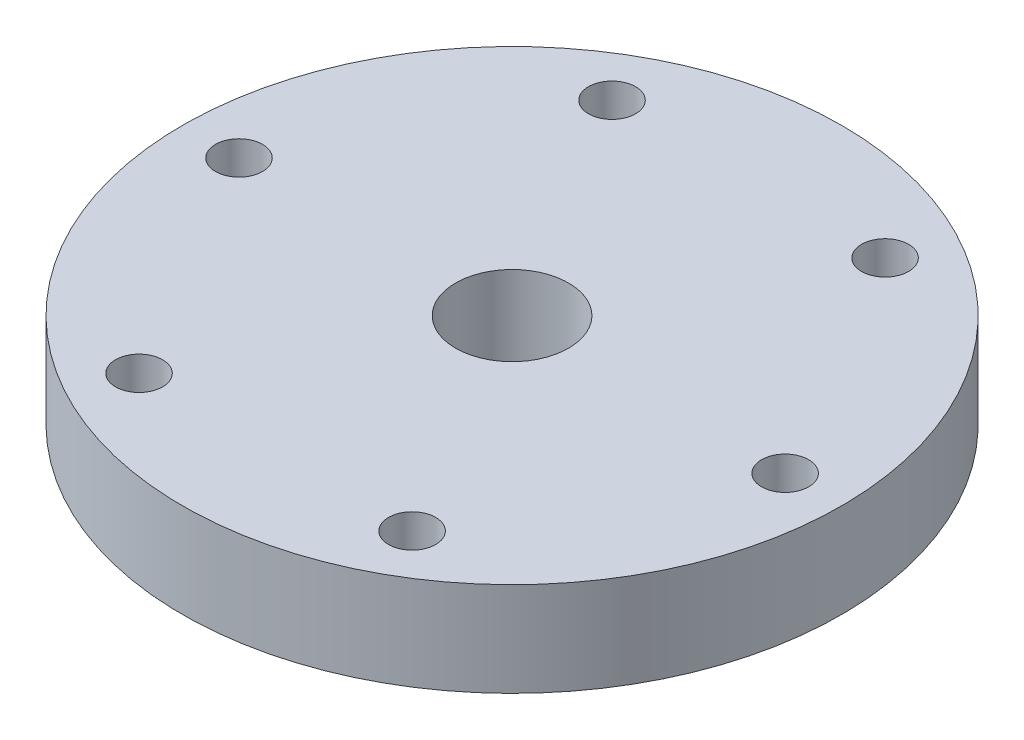
ISO-10303-21;
HEADER;
FILE_DESCRIPTION(('STEP AP214'),'2;1');
FILE_NAME('part.step','',(''),(''),'','','');
FILE_SCHEMA(('AUTOMOTIVE_DESIGN { 1 0 10303 214 1 1 1 1 }'));
ENDSEC;
DATA;
#1=APPLICATION_CONTEXT('core data for automotive mechanical design processes');
#2=APPLICATION_PROTOCOL_DEFINITION('international standard','automotive_design',2000,#1);
#3=PRODUCT_CONTEXT('',#1,'mechanical');
#4=PRODUCT('Part','Part','',(#3));
#5=PRODUCT_RELATED_PRODUCT_CATEGORY('part','',(#4));
#6=PRODUCT_DEFINITION_FORMATION('','',#4);
#7=PRODUCT_DEFINITION_CONTEXT('part definition',#1,'design');
#8=PRODUCT_DEFINITION('design','',#6,#7);
#9=PRODUCT_DEFINITION_SHAPE('','',#8);
#10=(LENGTH_UNIT() NAMED_UNIT(*) SI_UNIT(.MILLI.,.METRE.));
#11=(NAMED_UNIT(*) PLANE_ANGLE_UNIT() SI_UNIT($,.RADIAN.));
#12=(NAMED_UNIT(*) SI_UNIT($,.STERADIAN.) SOLID_ANGLE_UNIT());
#13=UNCERTAINTY_MEASURE_WITH_UNIT(LENGTH_MEASURE(1.E-05),#10,'distance_accuracy_value','');
#14=(GEOMETRIC_REPRESENTATION_CONTEXT(3) GLOBAL_UNCERTAINTY_ASSIGNED_CONTEXT((#13)) GLOBAL_UNIT_ASSIGNED_CONTEXT((#10,
#11,#12)) REPRESENTATION_CONTEXT('',''));
#15=CARTESIAN_POINT('',(0.,0.,0.));
#16=DIRECTION('',(0.,0.,1.));
#17=DIRECTION('',(1.,0.,0.));
#18=AXIS2_PLACEMENT_3D('',#15,#16,#17);
#19=CARTESIAN_POINT('',(15.,0.,0.));
#20=DIRECTION('',(0.,-1.,0.));
#21=DIRECTION('',(0.,0.,-1.));
#22=AXIS2_PLACEMENT_3D('',#19,#20,#21);
#23=PLANE('',#22);
#24=CARTESIAN_POINT('',(0.,0.,0.));
#25=DIRECTION('',(0.,1.,0.));
#26=DIRECTION('',(0.,0.,1.));
#27=AXIS2_PLACEMENT_3D('',#24,#25,#26);
#28=CIRCLE('',#27,5.99999999999999);
#29=CARTESIAN_POINT('',(0.,0.,5.99999999999999));
#30=VERTEX_POINT('',#29);
#31=EDGE_CURVE('E112',#30,#30,#28,.T.);
#32=ORIENTED_EDGE('',*,*,#31,.T.);
#33=EDGE_LOOP('',(#32));
#34=FACE_BOUND('',#33,.T.);
#35=CARTESIAN_POINT('',(0.,0.,0.));
#36=DIRECTION('',(0.,-1.,0.));
#37=DIRECTION('',(0.,0.,-1.));
#38=AXIS2_PLACEMENT_3D('',#35,#36,#37);
#39=CIRCLE('',#38,15.);
#40=CARTESIAN_POINT('',(0.,0.,-15.));
#41=VERTEX_POINT('',#40);
#42=EDGE_CURVE('E124',#41,#41,#39,.T.);
#43=ORIENTED_EDGE('',*,*,#42,.T.);
#44=EDGE_LOOP('',(#43));
#45=FACE_BOUND('',#44,.T.);
#46=ADVANCED_FACE('F47',(#34,#45),#23,.T.);
#47=CARTESIAN_POINT('',(2.,15.,0.));
#48=DIRECTION('',(0.,1.,0.));
#49=DIRECTION('',(0.,0.,1.));
#50=AXIS2_PLACEMENT_3D('',#47,#48,#49);
#51=PLANE('',#50);
#52=CARTESIAN_POINT('',(14.5000000000003,15.,-25.1147367097486));
#53=DIRECTION('',(0.,1.,0.));
#54=DIRECTION('',(0.,0.,1.));
#55=AXIS2_PLACEMENT_3D('',#52,#53,#54);
#56=CIRCLE('',#55,2.49999999999999);
#57=CARTESIAN_POINT('',(14.5000000000003,15.,-22.6147367097486));
#58=VERTEX_POINT('',#57);
#59=EDGE_CURVE('E100',#58,#58,#56,.T.);
#60=ORIENTED_EDGE('',*,*,#59,.F.);
#61=EDGE_LOOP('',(#60));
#62=FACE_BOUND('',#61,.T.);
#63=CARTESIAN_POINT('',(-14.4999999999998,15.,-25.1147367097489));
#64=DIRECTION('',(0.,1.,0.));
#65=DIRECTION('',(0.,0.,1.));
#66=AXIS2_PLACEMENT_3D('',#63,#64,#65);
#67=CIRCLE('',#66,2.49999999999999);
#68=CARTESIAN_POINT('',(-14.4999999999998,15.,-22.6147367097489));
#69=VERTEX_POINT('',#68);
#70=EDGE_CURVE('E85',#69,#69,#67,.T.);
#71=ORIENTED_EDGE('',*,*,#70,.F.);
#72=EDGE_LOOP('',(#71));
#73=FACE_BOUND('',#72,.T.);
#74=CARTESIAN_POINT('',(-29.,15.,0.));
#75=DIRECTION('',(0.,1.,0.));
#76=DIRECTION('',(0.,0.,1.));
#77=AXIS2_PLACEMENT_3D('',#74,#75,#76);
#78=CIRCLE('',#77,2.49999999999999);
#79=CARTESIAN_POINT('',(-29.,15.,2.49999999999999));
#80=VERTEX_POINT('',#79);
#81=EDGE_CURVE('E81',#80,#80,#78,.T.);
#82=ORIENTED_EDGE('',*,*,#81,.F.);
#83=EDGE_LOOP('',(#82));
#84=FACE_BOUND('',#83,.T.);
#85=CARTESIAN_POINT('',(-14.5000000000001,15.,25.1147367097487));
#86=DIRECTION('',(0.,1.,0.));
#87=DIRECTION('',(0.,0.,1.));
#88=AXIS2_PLACEMENT_3D('',#85,#86,#87);
#89=CIRCLE('',#88,2.49999999999999);
#90=CARTESIAN_POINT('',(-14.5000000000001,15.,27.6147367097486));
#91=VERTEX_POINT('',#90);
#92=EDGE_CURVE('E77',#91,#91,#89,.T.);
#93=ORIENTED_EDGE('',*,*,#92,.F.);
#94=EDGE_LOOP('',(#93));
#95=FACE_BOUND('',#94,.T.);
#96=CARTESIAN_POINT('',(14.4999999999999,15.,25.1147367097488));
#97=DIRECTION('',(0.,1.,0.));
#98=DIRECTION('',(0.,0.,1.));
#99=AXIS2_PLACEMENT_3D('',#96,#97,#98);
#100=CIRCLE('',#99,2.49999999999999);
#101=CARTESIAN_POINT('',(14.4999999999999,15.,27.6147367097487));
#102=VERTEX_POINT('',#101);
#103=EDGE_CURVE('E72',#102,#102,#100,.T.);
#104=ORIENTED_EDGE('',*,*,#103,.F.);
#105=EDGE_LOOP('',(#104));
#106=FACE_BOUND('',#105,.T.);
#107=CARTESIAN_POINT('',(0.,15.,0.));
#108=DIRECTION('',(0.,1.,0.));
#109=DIRECTION('',(0.,0.,1.));
#110=AXIS2_PLACEMENT_3D('',#107,#108,#109);
#111=CIRCLE('',#110,5.99999999999999);
#112=CARTESIAN_POINT('',(0.,15.,5.99999999999999));
#113=VERTEX_POINT('',#112);
#114=EDGE_CURVE('E71',#113,#113,#111,.T.);
#115=ORIENTED_EDGE('',*,*,#114,.F.);
#116=EDGE_LOOP('',(#115));
#117=FACE_BOUND('',#116,.T.);
#118=CARTESIAN_POINT('',(29.,15.,0.));
#119=DIRECTION('',(0.,1.,0.));
#120=DIRECTION('',(0.,0.,1.));
#121=AXIS2_PLACEMENT_3D('',#118,#119,#120);
#122=CIRCLE('',#121,2.49999999999998);
#123=CARTESIAN_POINT('',(29.,15.,2.49999999999998));
#124=VERTEX_POINT('',#123);
#125=EDGE_CURVE('E116',#124,#124,#122,.T.);
#126=ORIENTED_EDGE('',*,*,#125,.F.);
#127=EDGE_LOOP('',(#126));
#128=FACE_BOUND('',#127,.T.);
#129=CARTESIAN_POINT('',(0.,15.,0.));
#130=DIRECTION('',(0.,-1.,0.));
#131=DIRECTION('',(0.,0.,-1.));
#132=AXIS2_PLACEMENT_3D('',#129,#130,#131);
#133=CIRCLE('',#132,35.);
#134=CARTESIAN_POINT('',(0.,15.,-35.));
#135=VERTEX_POINT('',#134);
#136=EDGE_CURVE('E63',#135,#135,#133,.T.);
#137=ORIENTED_EDGE('',*,*,#136,.F.);
#138=EDGE_LOOP('',(#137));
#139=FACE_BOUND('',#138,.T.);
#140=ADVANCED_FACE('F139',(#62,#73,#84,#95,#106,#117,#128,#139),#51,.T.);
#141=CARTESIAN_POINT('',(0.,0.,0.));
#142=DIRECTION('',(0.,-1.,0.));
#143=DIRECTION('',(0.,0.,-1.));
#144=AXIS2_PLACEMENT_3D('',#141,#142,#143);
#145=CYLINDRICAL_SURFACE('',#144,35.);
#146=ORIENTED_EDGE('',*,*,#136,.T.);
#147=EDGE_LOOP('',(#146));
#148=FACE_BOUND('',#147,.T.);
#149=CARTESIAN_POINT('',(0.,5.,0.));
#150=DIRECTION('',(0.,-1.,0.));
#151=DIRECTION('',(0.,0.,-1.));
#152=AXIS2_PLACEMENT_3D('',#149,#150,#151);
#153=CIRCLE('',#152,35.);
#154=CARTESIAN_POINT('',(0.,5.,-35.));
#155=VERTEX_POINT('',#154);
#156=EDGE_CURVE('E128',#155,#155,#153,.T.);
#157=ORIENTED_EDGE('',*,*,#156,.F.);
#158=EDGE_LOOP('',(#157));
#159=FACE_BOUND('',#158,.T.);
#160=ADVANCED_FACE('F136',(#148,#159),#145,.T.);
#161=CARTESIAN_POINT('',(35.,5.,0.));
#162=DIRECTION('',(0.,-1.,0.));
#163=DIRECTION('',(0.,0.,-1.));
#164=AXIS2_PLACEMENT_3D('',#161,#162,#163);
#165=PLANE('',#164);
#166=CARTESIAN_POINT('',(14.5000000000003,5.,-25.1147367097486));
#167=DIRECTION('',(0.,-1.,0.));
#168=DIRECTION('',(0.,0.,-1.));
#169=AXIS2_PLACEMENT_3D('',#166,#167,#168);
#170=CIRCLE('',#169,2.49999999999999);
#171=CARTESIAN_POINT('',(14.5000000000003,5.,-27.6147367097485));
#172=VERTEX_POINT('',#171);
#173=EDGE_CURVE('E51',#172,#172,#170,.T.);
#174=ORIENTED_EDGE('',*,*,#173,.F.);
#175=EDGE_LOOP('',(#174));
#176=FACE_BOUND('',#175,.T.);
#177=CARTESIAN_POINT('',(-14.4999999999998,5.,-25.1147367097489));
#178=DIRECTION('',(0.,-1.,0.));
#179=DIRECTION('',(0.,0.,-1.));
#180=AXIS2_PLACEMENT_3D('',#177,#178,#179);
#181=CIRCLE('',#180,2.49999999999999);
#182=CARTESIAN_POINT('',(-14.4999999999998,5.,-27.6147367097488));
#183=VERTEX_POINT('',#182);
#184=EDGE_CURVE('E82',#183,#183,#181,.T.);
#185=ORIENTED_EDGE('',*,*,#184,.F.);
#186=EDGE_LOOP('',(#185));
#187=FACE_BOUND('',#186,.T.);
#188=CARTESIAN_POINT('',(-29.,5.,0.));
#189=DIRECTION('',(0.,-1.,0.));
#190=DIRECTION('',(0.,0.,-1.));
#191=AXIS2_PLACEMENT_3D('',#188,#189,#190);
#192=CIRCLE('',#191,2.49999999999999);
#193=CARTESIAN_POINT('',(-29.,5.,-2.49999999999999));
#194=VERTEX_POINT('',#193);
#195=EDGE_CURVE('E78',#194,#194,#192,.T.);
#196=ORIENTED_EDGE('',*,*,#195,.F.);
#197=EDGE_LOOP('',(#196));
#198=FACE_BOUND('',#197,.T.);
#199=CARTESIAN_POINT('',(-14.5000000000001,5.,25.1147367097487));
#200=DIRECTION('',(0.,-1.,0.));
#201=DIRECTION('',(0.,0.,-1.));
#202=AXIS2_PLACEMENT_3D('',#199,#200,#201);
#203=CIRCLE('',#202,2.49999999999999);
#204=CARTESIAN_POINT('',(-14.5000000000001,5.,22.6147367097487));
#205=VERTEX_POINT('',#204);
#206=EDGE_CURVE('E73',#205,#205,#203,.T.);
#207=ORIENTED_EDGE('',*,*,#206,.F.);
#208=EDGE_LOOP('',(#207));
#209=FACE_BOUND('',#208,.T.);
#210=CARTESIAN_POINT('',(14.4999999999999,5.,25.1147367097488));
#211=DIRECTION('',(0.,-1.,0.));
#212=DIRECTION('',(0.,0.,-1.));
#213=AXIS2_PLACEMENT_3D('',#210,#211,#212);
#214=CIRCLE('',#213,2.49999999999999);
#215=CARTESIAN_POINT('',(14.4999999999999,5.,22.6147367097488));
#216=VERTEX_POINT('',#215);
#217=EDGE_CURVE('E67',#216,#216,#214,.T.);
#218=ORIENTED_EDGE('',*,*,#217,.F.);
#219=EDGE_LOOP('',(#218));
#220=FACE_BOUND('',#219,.T.);
#221=CARTESIAN_POINT('',(29.,5.,0.));
#222=DIRECTION('',(0.,-1.,0.));
#223=DIRECTION('',(0.,0.,-1.));
#224=AXIS2_PLACEMENT_3D('',#221,#222,#223);
#225=CIRCLE('',#224,2.49999999999999);
#226=CARTESIAN_POINT('',(29.,5.,-2.49999999999999));
#227=VERTEX_POINT('',#226);
#228=EDGE_CURVE('E120',#227,#227,#225,.T.);
#229=ORIENTED_EDGE('',*,*,#228,.F.);
#230=EDGE_LOOP('',(#229));
#231=FACE_BOUND('',#230,.T.);
#232=CARTESIAN_POINT('',(0.,5.,0.));
#233=DIRECTION('',(0.,-1.,0.));
#234=DIRECTION('',(0.,0.,-1.));
#235=AXIS2_PLACEMENT_3D('',#232,#233,#234);
#236=CIRCLE('',#235,17.);
#237=CARTESIAN_POINT('',(0.,5.,-17.));
#238=VERTEX_POINT('',#237);
#239=EDGE_CURVE('E10',#238,#238,#236,.F.);
#240=ORIENTED_EDGE('',*,*,#239,.T.);
#241=EDGE_LOOP('',(#240));
#242=FACE_BOUND('',#241,.T.);
#243=ORIENTED_EDGE('',*,*,#156,.T.);
#244=EDGE_LOOP('',(#243));
#245=FACE_BOUND('',#244,.T.);
#246=ADVANCED_FACE('F147',(#176,#187,#198,#209,#220,#231,#242,#245),#165,.T.);
#247=CARTESIAN_POINT('',(0.,0.,0.));
#248=DIRECTION('',(0.,-1.,0.));
#249=DIRECTION('',(0.,0.,-1.));
#250=AXIS2_PLACEMENT_3D('',#247,#248,#249);
#251=CYLINDRICAL_SURFACE('',#250,15.);
#252=CARTESIAN_POINT('',(0.,3.,0.));
#253=DIRECTION('',(0.,-1.,0.));
#254=DIRECTION('',(0.,0.,-1.));
#255=AXIS2_PLACEMENT_3D('',#252,#253,#254);
#256=CIRCLE('',#255,15.);
#257=CARTESIAN_POINT('',(0.,3.,-15.));
#258=VERTEX_POINT('',#257);
#259=EDGE_CURVE('E56',#258,#258,#256,.T.);
#260=ORIENTED_EDGE('',*,*,#259,.T.);
#261=EDGE_LOOP('',(#260));
#262=FACE_BOUND('',#261,.T.);
#263=ORIENTED_EDGE('',*,*,#42,.F.);
#264=EDGE_LOOP('',(#263));
#265=FACE_BOUND('',#264,.T.);
#266=ADVANCED_FACE('F156',(#262,#265),#251,.T.);
#267=CARTESIAN_POINT('',(0.,3.,0.));
#268=DIRECTION('',(0.,-1.,0.));
#269=DIRECTION('',(0.,0.,-1.));
#270=AXIS2_PLACEMENT_3D('',#267,#268,#269);
#271=TOROIDAL_SURFACE('',#270,17.,2.);
#272=ORIENTED_EDGE('',*,*,#239,.F.);
#273=EDGE_LOOP('',(#272));
#274=FACE_BOUND('',#273,.T.);
#275=ORIENTED_EDGE('',*,*,#259,.F.);
#276=EDGE_LOOP('',(#275));
#277=FACE_BOUND('',#276,.T.);
#278=ADVANCED_FACE('F49',(#274,#277),#271,.F.);
#279=CARTESIAN_POINT('',(29.,15.,0.));
#280=DIRECTION('',(0.,1.,0.));
#281=DIRECTION('',(0.,0.,1.));
#282=AXIS2_PLACEMENT_3D('',#279,#280,#281);
#283=CYLINDRICAL_SURFACE('',#282,2.49999999999999);
#284=ORIENTED_EDGE('',*,*,#228,.T.);
#285=EDGE_LOOP('',(#284));
#286=FACE_BOUND('',#285,.T.);
#287=ORIENTED_EDGE('',*,*,#125,.T.);
#288=EDGE_LOOP('',(#287));
#289=FACE_BOUND('',#288,.T.);
#290=ADVANCED_FACE('F161',(#286,#289),#283,.F.);
#291=CARTESIAN_POINT('',(0.,15.,0.));
#292=DIRECTION('',(0.,1.,0.));
#293=DIRECTION('',(0.,0.,1.));
#294=AXIS2_PLACEMENT_3D('',#291,#292,#293);
#295=CYLINDRICAL_SURFACE('',#294,5.99999999999999);
#296=ORIENTED_EDGE('',*,*,#31,.F.);
#297=EDGE_LOOP('',(#296));
#298=FACE_BOUND('',#297,.T.);
#299=ORIENTED_EDGE('',*,*,#114,.T.);
#300=EDGE_LOOP('',(#299));
#301=FACE_BOUND('',#300,.T.);
#302=ADVANCED_FACE('F164',(#298,#301),#295,.F.);
#303=CARTESIAN_POINT('',(14.4999999999999,15.,25.1147367097488));
#304=DIRECTION('',(0.,1.,0.));
#305=DIRECTION('',(0.,0.,1.));
#306=AXIS2_PLACEMENT_3D('',#303,#304,#305);
#307=CYLINDRICAL_SURFACE('',#306,2.49999999999999);
#308=ORIENTED_EDGE('',*,*,#217,.T.);
#309=EDGE_LOOP('',(#308));
#310=FACE_BOUND('',#309,.T.);
#311=ORIENTED_EDGE('',*,*,#103,.T.);
#312=EDGE_LOOP('',(#311));
#313=FACE_BOUND('',#312,.T.);
#314=ADVANCED_FACE('F168',(#310,#313),#307,.F.);
#315=CARTESIAN_POINT('',(-14.5000000000001,15.,25.1147367097487));
#316=DIRECTION('',(0.,1.,0.));
#317=DIRECTION('',(0.,0.,1.));
#318=AXIS2_PLACEMENT_3D('',#315,#316,#317);
#319=CYLINDRICAL_SURFACE('',#318,2.49999999999999);
#320=ORIENTED_EDGE('',*,*,#206,.T.);
#321=EDGE_LOOP('',(#320));
#322=FACE_BOUND('',#321,.T.);
#323=ORIENTED_EDGE('',*,*,#92,.T.);
#324=EDGE_LOOP('',(#323));
#325=FACE_BOUND('',#324,.T.);
#326=ADVANCED_FACE('F172',(#322,#325),#319,.F.);
#327=CARTESIAN_POINT('',(-29.,15.,0.));
#328=DIRECTION('',(0.,1.,0.));
#329=DIRECTION('',(0.,0.,1.));
#330=AXIS2_PLACEMENT_3D('',#327,#328,#329);
#331=CYLINDRICAL_SURFACE('',#330,2.49999999999999);
#332=ORIENTED_EDGE('',*,*,#195,.T.);
#333=EDGE_LOOP('',(#332));
#334=FACE_BOUND('',#333,.T.);
#335=ORIENTED_EDGE('',*,*,#81,.T.);
#336=EDGE_LOOP('',(#335));
#337=FACE_BOUND('',#336,.T.);
#338=ADVANCED_FACE('F176',(#334,#337),#331,.F.);
#339=CARTESIAN_POINT('',(-14.4999999999998,15.,-25.1147367097489));
#340=DIRECTION('',(0.,1.,0.));
#341=DIRECTION('',(0.,0.,1.));
#342=AXIS2_PLACEMENT_3D('',#339,#340,#341);
#343=CYLINDRICAL_SURFACE('',#342,2.49999999999999);
#344=ORIENTED_EDGE('',*,*,#184,.T.);
#345=EDGE_LOOP('',(#344));
#346=FACE_BOUND('',#345,.T.);
#347=ORIENTED_EDGE('',*,*,#70,.T.);
#348=EDGE_LOOP('',(#347));
#349=FACE_BOUND('',#348,.T.);
#350=ADVANCED_FACE('F180',(#346,#349),#343,.F.);
#351=CARTESIAN_POINT('',(14.5000000000003,15.,-25.1147367097486));
#352=DIRECTION('',(0.,1.,0.));
#353=DIRECTION('',(0.,0.,1.));
#354=AXIS2_PLACEMENT_3D('',#351,#352,#353);
#355=CYLINDRICAL_SURFACE('',#354,2.49999999999999);
#356=ORIENTED_EDGE('',*,*,#173,.T.);
#357=EDGE_LOOP('',(#356));
#358=FACE_BOUND('',#357,.T.);
#359=ORIENTED_EDGE('',*,*,#59,.T.);
#360=EDGE_LOOP('',(#359));
#361=FACE_BOUND('',#360,.T.);
#362=ADVANCED_FACE('F183',(#358,#361),#355,.F.);
#363=CLOSED_SHELL('',(#46,#140,#160,#246,#266,#278,#290,#302,#314,#326,#338,#350,#362));
#364=MANIFOLD_SOLID_BREP('B2',#363);
#365=ADVANCED_BREP_SHAPE_REPRESENTATION('',(#18,#364),#14);
#366=SHAPE_DEFINITION_REPRESENTATION(#9,#365);
ENDSEC;
END-ISO-10303-21;
